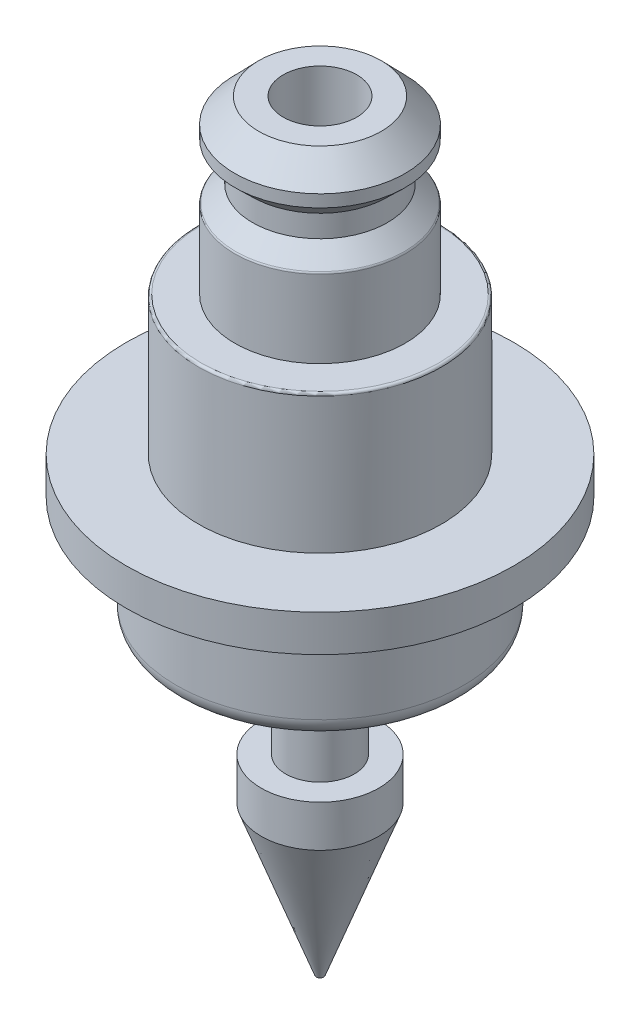
ISO-10303-21;
HEADER;
FILE_DESCRIPTION(('STEP AP214'),'2;1');
FILE_NAME('part.step','',(''),(''),'','','');
FILE_SCHEMA(('AUTOMOTIVE_DESIGN { 1 0 10303 214 1 1 1 1 }'));
ENDSEC;
DATA;
#1=APPLICATION_CONTEXT('core data for automotive mechanical design processes');
#2=APPLICATION_PROTOCOL_DEFINITION('international standard','automotive_design',2000,#1);
#3=PRODUCT_CONTEXT('',#1,'mechanical');
#4=PRODUCT('Part','Part','',(#3));
#5=PRODUCT_RELATED_PRODUCT_CATEGORY('part','',(#4));
#6=PRODUCT_DEFINITION_FORMATION('','',#4);
#7=PRODUCT_DEFINITION_CONTEXT('part definition',#1,'design');
#8=PRODUCT_DEFINITION('design','',#6,#7);
#9=PRODUCT_DEFINITION_SHAPE('','',#8);
#10=(LENGTH_UNIT() NAMED_UNIT(*) SI_UNIT(.MILLI.,.METRE.));
#11=(NAMED_UNIT(*) PLANE_ANGLE_UNIT() SI_UNIT($,.RADIAN.));
#12=(NAMED_UNIT(*) SI_UNIT($,.STERADIAN.) SOLID_ANGLE_UNIT());
#13=UNCERTAINTY_MEASURE_WITH_UNIT(LENGTH_MEASURE(1.E-05),#10,'distance_accuracy_value','');
#14=(GEOMETRIC_REPRESENTATION_CONTEXT(3) GLOBAL_UNCERTAINTY_ASSIGNED_CONTEXT((#13)) GLOBAL_UNIT_ASSIGNED_CONTEXT((#10,
#11,#12)) REPRESENTATION_CONTEXT('',''));
#15=CARTESIAN_POINT('',(0.,0.,0.));
#16=DIRECTION('',(0.,0.,1.));
#17=DIRECTION('',(1.,0.,0.));
#18=AXIS2_PLACEMENT_3D('',#15,#16,#17);
#19=CARTESIAN_POINT('',(0.,0.,0.));
#20=DIRECTION('',(0.,-1.,0.));
#21=DIRECTION('',(0.,0.,-1.));
#22=AXIS2_PLACEMENT_3D('',#19,#20,#21);
#23=CYLINDRICAL_SURFACE('',#22,1.5);
#24=CARTESIAN_POINT('',(0.,0.,0.));
#25=DIRECTION('',(0.,-1.,0.));
#26=DIRECTION('',(0.,0.,-1.));
#27=AXIS2_PLACEMENT_3D('',#24,#25,#26);
#28=CIRCLE('',#27,1.5);
#29=CARTESIAN_POINT('',(0.,0.,-1.5));
#30=VERTEX_POINT('',#29);
#31=EDGE_CURVE('E109',#30,#30,#28,.T.);
#32=ORIENTED_EDGE('',*,*,#31,.T.);
#33=EDGE_LOOP('',(#32));
#34=FACE_BOUND('',#33,.T.);
#35=CARTESIAN_POINT('',(0.,14.15,0.));
#36=DIRECTION('',(0.,-1.,0.));
#37=DIRECTION('',(0.,0.,-1.));
#38=AXIS2_PLACEMENT_3D('',#35,#36,#37);
#39=CIRCLE('',#38,1.5);
#40=CARTESIAN_POINT('',(0.,14.15,-1.5));
#41=VERTEX_POINT('',#40);
#42=EDGE_CURVE('E58',#41,#41,#39,.T.);
#43=ORIENTED_EDGE('',*,*,#42,.F.);
#44=EDGE_LOOP('',(#43));
#45=FACE_BOUND('',#44,.T.);
#46=ADVANCED_FACE('F32',(#34,#45),#23,.F.);
#47=CARTESIAN_POINT('',(1.5,14.15,0.));
#48=DIRECTION('',(0.,1.,0.));
#49=DIRECTION('',(0.,0.,1.));
#50=AXIS2_PLACEMENT_3D('',#47,#48,#49);
#51=PLANE('',#50);
#52=ORIENTED_EDGE('',*,*,#42,.T.);
#53=EDGE_LOOP('',(#52));
#54=FACE_BOUND('',#53,.T.);
#55=CARTESIAN_POINT('',(0.,14.15,0.));
#56=DIRECTION('',(0.,-1.,0.));
#57=DIRECTION('',(0.,0.,-1.));
#58=AXIS2_PLACEMENT_3D('',#55,#56,#57);
#59=CIRCLE('',#58,2.5);
#60=CARTESIAN_POINT('',(0.,14.15,-2.5));
#61=VERTEX_POINT('',#60);
#62=EDGE_CURVE('E61',#61,#61,#59,.T.);
#63=ORIENTED_EDGE('',*,*,#62,.F.);
#64=EDGE_LOOP('',(#63));
#65=FACE_BOUND('',#64,.T.);
#66=ADVANCED_FACE('F132',(#54,#65),#51,.T.);
#67=CARTESIAN_POINT('',(0.,13.15,0.));
#68=DIRECTION('',(0.,-1.,0.));
#69=DIRECTION('',(0.,0.,-1.));
#70=AXIS2_PLACEMENT_3D('',#67,#68,#69);
#71=CONICAL_SURFACE('',#70,3.475,0.772740611563396);
#72=ORIENTED_EDGE('',*,*,#62,.T.);
#73=EDGE_LOOP('',(#72));
#74=FACE_BOUND('',#73,.T.);
#75=CARTESIAN_POINT('',(0.,13.15,0.));
#76=DIRECTION('',(0.,-1.,0.));
#77=DIRECTION('',(0.,0.,-1.));
#78=AXIS2_PLACEMENT_3D('',#75,#76,#77);
#79=CIRCLE('',#78,3.475);
#80=CARTESIAN_POINT('',(0.,13.15,-3.475));
#81=VERTEX_POINT('',#80);
#82=EDGE_CURVE('E64',#81,#81,#79,.T.);
#83=ORIENTED_EDGE('',*,*,#82,.F.);
#84=EDGE_LOOP('',(#83));
#85=FACE_BOUND('',#84,.T.);
#86=ADVANCED_FACE('F137',(#74,#85),#71,.T.);
#87=CARTESIAN_POINT('',(0.,0.,0.));
#88=DIRECTION('',(0.,-1.,0.));
#89=DIRECTION('',(0.,0.,-1.));
#90=AXIS2_PLACEMENT_3D('',#87,#88,#89);
#91=CYLINDRICAL_SURFACE('',#90,3.475);
#92=ORIENTED_EDGE('',*,*,#82,.T.);
#93=EDGE_LOOP('',(#92));
#94=FACE_BOUND('',#93,.T.);
#95=CARTESIAN_POINT('',(0.,12.65,0.));
#96=DIRECTION('',(0.,-1.,0.));
#97=DIRECTION('',(0.,0.,-1.));
#98=AXIS2_PLACEMENT_3D('',#95,#96,#97);
#99=CIRCLE('',#98,3.475);
#100=CARTESIAN_POINT('',(0.,12.65,-3.475));
#101=VERTEX_POINT('',#100);
#102=EDGE_CURVE('E67',#101,#101,#99,.T.);
#103=ORIENTED_EDGE('',*,*,#102,.F.);
#104=EDGE_LOOP('',(#103));
#105=FACE_BOUND('',#104,.T.);
#106=ADVANCED_FACE('F179',(#94,#105),#91,.T.);
#107=CARTESIAN_POINT('',(0.,11.95,0.));
#108=DIRECTION('',(0.,1.,0.));
#109=DIRECTION('',(0.,0.,1.));
#110=AXIS2_PLACEMENT_3D('',#107,#108,#109);
#111=CONICAL_SURFACE('',#110,2.75,0.80294022345485);
#112=ORIENTED_EDGE('',*,*,#102,.T.);
#113=EDGE_LOOP('',(#112));
#114=FACE_BOUND('',#113,.T.);
#115=CARTESIAN_POINT('',(0.,11.95,0.));
#116=DIRECTION('',(0.,-1.,0.));
#117=DIRECTION('',(0.,0.,-1.));
#118=AXIS2_PLACEMENT_3D('',#115,#116,#117);
#119=CIRCLE('',#118,2.75);
#120=CARTESIAN_POINT('',(0.,11.95,-2.75));
#121=VERTEX_POINT('',#120);
#122=EDGE_CURVE('E70',#121,#121,#119,.T.);
#123=ORIENTED_EDGE('',*,*,#122,.F.);
#124=EDGE_LOOP('',(#123));
#125=FACE_BOUND('',#124,.T.);
#126=ADVANCED_FACE('F175',(#114,#125),#111,.T.);
#127=CARTESIAN_POINT('',(0.,0.,0.));
#128=DIRECTION('',(0.,-1.,0.));
#129=DIRECTION('',(0.,0.,-1.));
#130=AXIS2_PLACEMENT_3D('',#127,#128,#129);
#131=CYLINDRICAL_SURFACE('',#130,2.75);
#132=ORIENTED_EDGE('',*,*,#122,.T.);
#133=EDGE_LOOP('',(#132));
#134=FACE_BOUND('',#133,.T.);
#135=CARTESIAN_POINT('',(0.,11.05,0.));
#136=DIRECTION('',(0.,-1.,0.));
#137=DIRECTION('',(0.,0.,-1.));
#138=AXIS2_PLACEMENT_3D('',#135,#136,#137);
#139=CIRCLE('',#138,2.75);
#140=CARTESIAN_POINT('',(0.,11.05,-2.75));
#141=VERTEX_POINT('',#140);
#142=EDGE_CURVE('E73',#141,#141,#139,.T.);
#143=ORIENTED_EDGE('',*,*,#142,.F.);
#144=EDGE_LOOP('',(#143));
#145=FACE_BOUND('',#144,.T.);
#146=ADVANCED_FACE('F171',(#134,#145),#131,.T.);
#147=CARTESIAN_POINT('',(0.,10.35,0.));
#148=DIRECTION('',(0.,-1.,0.));
#149=DIRECTION('',(0.,0.,-1.));
#150=AXIS2_PLACEMENT_3D('',#147,#148,#149);
#151=CONICAL_SURFACE('',#150,3.475,0.802940223454851);
#152=CARTESIAN_POINT('',(0.,10.3794874262635,0.));
#153=DIRECTION('',(0.,1.,0.));
#154=DIRECTION('',(0.,0.,1.));
#155=AXIS2_PLACEMENT_3D('',#152,#153,#154);
#156=CIRCLE('',#155,3.44445945136996);
#157=CARTESIAN_POINT('',(0.,10.3794874262635,3.44445945136996));
#158=VERTEX_POINT('',#157);
#159=EDGE_CURVE('E43',#158,#158,#156,.T.);
#160=ORIENTED_EDGE('',*,*,#159,.T.);
#161=EDGE_LOOP('',(#160));
#162=FACE_BOUND('',#161,.T.);
#163=ORIENTED_EDGE('',*,*,#142,.T.);
#164=EDGE_LOOP('',(#163));
#165=FACE_BOUND('',#164,.T.);
#166=ADVANCED_FACE('F155',(#162,#165),#151,.T.);
#167=CARTESIAN_POINT('',(0.,0.,0.));
#168=DIRECTION('',(0.,-1.,0.));
#169=DIRECTION('',(0.,0.,-1.));
#170=AXIS2_PLACEMENT_3D('',#167,#168,#169);
#171=CYLINDRICAL_SURFACE('',#170,3.475);
#172=CARTESIAN_POINT('',(0.,10.3075472802017,0.));
#173=DIRECTION('',(0.,1.,0.));
#174=DIRECTION('',(0.,0.,1.));
#175=AXIS2_PLACEMENT_3D('',#172,#173,#174);
#176=CIRCLE('',#175,3.475);
#177=CARTESIAN_POINT('',(0.,10.3075472802017,3.475));
#178=VERTEX_POINT('',#177);
#179=EDGE_CURVE('E47',#178,#178,#176,.F.);
#180=ORIENTED_EDGE('',*,*,#179,.T.);
#181=EDGE_LOOP('',(#180));
#182=FACE_BOUND('',#181,.T.);
#183=CARTESIAN_POINT('',(0.,7.15,0.));
#184=DIRECTION('',(0.,-1.,0.));
#185=DIRECTION('',(0.,0.,-1.));
#186=AXIS2_PLACEMENT_3D('',#183,#184,#185);
#187=CIRCLE('',#186,3.475);
#188=CARTESIAN_POINT('',(0.,7.15,-3.475));
#189=VERTEX_POINT('',#188);
#190=EDGE_CURVE('E76',#189,#189,#187,.T.);
#191=ORIENTED_EDGE('',*,*,#190,.F.);
#192=EDGE_LOOP('',(#191));
#193=FACE_BOUND('',#192,.T.);
#194=ADVANCED_FACE('F151',(#182,#193),#171,.T.);
#195=CARTESIAN_POINT('',(3.475,7.15,0.));
#196=DIRECTION('',(0.,1.,0.));
#197=DIRECTION('',(0.,0.,1.));
#198=AXIS2_PLACEMENT_3D('',#195,#196,#197);
#199=PLANE('',#198);
#200=CARTESIAN_POINT('',(0.,7.15,0.));
#201=DIRECTION('',(0.,1.,0.));
#202=DIRECTION('',(0.,0.,1.));
#203=AXIS2_PLACEMENT_3D('',#200,#201,#202);
#204=CIRCLE('',#203,4.855);
#205=CARTESIAN_POINT('',(0.,7.15,4.855));
#206=VERTEX_POINT('',#205);
#207=EDGE_CURVE('E10',#206,#206,#204,.T.);
#208=ORIENTED_EDGE('',*,*,#207,.T.);
#209=EDGE_LOOP('',(#208));
#210=FACE_BOUND('',#209,.T.);
#211=ORIENTED_EDGE('',*,*,#190,.T.);
#212=EDGE_LOOP('',(#211));
#213=FACE_BOUND('',#212,.T.);
#214=ADVANCED_FACE('F154',(#210,#213),#199,.T.);
#215=CARTESIAN_POINT('',(0.,0.,0.));
#216=DIRECTION('',(0.,-1.,0.));
#217=DIRECTION('',(0.,0.,-1.));
#218=AXIS2_PLACEMENT_3D('',#215,#216,#217);
#219=CYLINDRICAL_SURFACE('',#218,4.955);
#220=CARTESIAN_POINT('',(0.,7.05,0.));
#221=DIRECTION('',(0.,1.,0.));
#222=DIRECTION('',(0.,0.,1.));
#223=AXIS2_PLACEMENT_3D('',#220,#221,#222);
#224=CIRCLE('',#223,4.955);
#225=CARTESIAN_POINT('',(0.,7.05,4.955));
#226=VERTEX_POINT('',#225);
#227=EDGE_CURVE('E39',#226,#226,#224,.F.);
#228=ORIENTED_EDGE('',*,*,#227,.T.);
#229=EDGE_LOOP('',(#228));
#230=FACE_BOUND('',#229,.T.);
#231=CARTESIAN_POINT('',(0.,1.5,0.));
#232=DIRECTION('',(0.,-1.,0.));
#233=DIRECTION('',(0.,0.,-1.));
#234=AXIS2_PLACEMENT_3D('',#231,#232,#233);
#235=CIRCLE('',#234,4.955);
#236=CARTESIAN_POINT('',(0.,1.5,-4.955));
#237=VERTEX_POINT('',#236);
#238=EDGE_CURVE('E79',#237,#237,#235,.T.);
#239=ORIENTED_EDGE('',*,*,#238,.F.);
#240=EDGE_LOOP('',(#239));
#241=FACE_BOUND('',#240,.T.);
#242=ADVANCED_FACE('F160',(#230,#241),#219,.T.);
#243=CARTESIAN_POINT('',(4.955,1.5,0.));
#244=DIRECTION('',(0.,1.,0.));
#245=DIRECTION('',(0.,0.,1.));
#246=AXIS2_PLACEMENT_3D('',#243,#244,#245);
#247=PLANE('',#246);
#248=ORIENTED_EDGE('',*,*,#238,.T.);
#249=EDGE_LOOP('',(#248));
#250=FACE_BOUND('',#249,.T.);
#251=CARTESIAN_POINT('',(0.,1.5,0.));
#252=DIRECTION('',(0.,-1.,0.));
#253=DIRECTION('',(0.,0.,-1.));
#254=AXIS2_PLACEMENT_3D('',#251,#252,#253);
#255=CIRCLE('',#254,7.9);
#256=CARTESIAN_POINT('',(0.,1.5,-7.9));
#257=VERTEX_POINT('',#256);
#258=EDGE_CURVE('E82',#257,#257,#255,.T.);
#259=ORIENTED_EDGE('',*,*,#258,.F.);
#260=EDGE_LOOP('',(#259));
#261=FACE_BOUND('',#260,.T.);
#262=ADVANCED_FACE('F165',(#250,#261),#247,.T.);
#263=CARTESIAN_POINT('',(0.,0.,0.));
#264=DIRECTION('',(0.,-1.,0.));
#265=DIRECTION('',(0.,0.,-1.));
#266=AXIS2_PLACEMENT_3D('',#263,#264,#265);
#267=CYLINDRICAL_SURFACE('',#266,7.9);
#268=ORIENTED_EDGE('',*,*,#258,.T.);
#269=EDGE_LOOP('',(#268));
#270=FACE_BOUND('',#269,.T.);
#271=CARTESIAN_POINT('',(0.,0.,0.));
#272=DIRECTION('',(0.,-1.,0.));
#273=DIRECTION('',(0.,0.,-1.));
#274=AXIS2_PLACEMENT_3D('',#271,#272,#273);
#275=CIRCLE('',#274,7.9);
#276=CARTESIAN_POINT('',(0.,0.,-7.9));
#277=VERTEX_POINT('',#276);
#278=EDGE_CURVE('E85',#277,#277,#275,.T.);
#279=ORIENTED_EDGE('',*,*,#278,.F.);
#280=EDGE_LOOP('',(#279));
#281=FACE_BOUND('',#280,.T.);
#282=ADVANCED_FACE('F327',(#270,#281),#267,.T.);
#283=CARTESIAN_POINT('',(7.9,0.,0.));
#284=DIRECTION('',(0.,-1.,0.));
#285=DIRECTION('',(0.,0.,-1.));
#286=AXIS2_PLACEMENT_3D('',#283,#284,#285);
#287=PLANE('',#286);
#288=ORIENTED_EDGE('',*,*,#278,.T.);
#289=EDGE_LOOP('',(#288));
#290=FACE_BOUND('',#289,.T.);
#291=CARTESIAN_POINT('',(0.,0.,0.));
#292=DIRECTION('',(0.,-1.,0.));
#293=DIRECTION('',(0.,0.,-1.));
#294=AXIS2_PLACEMENT_3D('',#291,#292,#293);
#295=CIRCLE('',#294,5.85);
#296=CARTESIAN_POINT('',(0.,0.,-5.85));
#297=VERTEX_POINT('',#296);
#298=EDGE_CURVE('E88',#297,#297,#295,.T.);
#299=ORIENTED_EDGE('',*,*,#298,.F.);
#300=EDGE_LOOP('',(#299));
#301=FACE_BOUND('',#300,.T.);
#302=ADVANCED_FACE('F318',(#290,#301),#287,.T.);
#303=CARTESIAN_POINT('',(0.,0.,0.));
#304=DIRECTION('',(0.,-1.,0.));
#305=DIRECTION('',(0.,0.,-1.));
#306=AXIS2_PLACEMENT_3D('',#303,#304,#305);
#307=CYLINDRICAL_SURFACE('',#306,5.85);
#308=CARTESIAN_POINT('',(0.,-3.75,0.));
#309=DIRECTION('',(0.,-1.,0.));
#310=DIRECTION('',(0.,0.,-1.));
#311=AXIS2_PLACEMENT_3D('',#308,#309,#310);
#312=CIRCLE('',#311,5.85);
#313=CARTESIAN_POINT('',(0.,-3.75,-5.85));
#314=VERTEX_POINT('',#313);
#315=EDGE_CURVE('E52',#314,#314,#312,.F.);
#316=ORIENTED_EDGE('',*,*,#315,.T.);
#317=EDGE_LOOP('',(#316));
#318=FACE_BOUND('',#317,.T.);
#319=ORIENTED_EDGE('',*,*,#298,.T.);
#320=EDGE_LOOP('',(#319));
#321=FACE_BOUND('',#320,.T.);
#322=ADVANCED_FACE('F309',(#318,#321),#307,.T.);
#323=CARTESIAN_POINT('',(5.85,-4.5,0.));
#324=DIRECTION('',(0.,-1.,0.));
#325=DIRECTION('',(0.,0.,-1.));
#326=AXIS2_PLACEMENT_3D('',#323,#324,#325);
#327=PLANE('',#326);
#328=CARTESIAN_POINT('',(0.,-4.5,0.));
#329=DIRECTION('',(0.,-1.,0.));
#330=DIRECTION('',(0.,0.,-1.));
#331=AXIS2_PLACEMENT_3D('',#328,#329,#330);
#332=CIRCLE('',#331,5.1);
#333=CARTESIAN_POINT('',(0.,-4.5,-5.1));
#334=VERTEX_POINT('',#333);
#335=EDGE_CURVE('E55',#334,#334,#332,.T.);
#336=ORIENTED_EDGE('',*,*,#335,.T.);
#337=EDGE_LOOP('',(#336));
#338=FACE_BOUND('',#337,.T.);
#339=CARTESIAN_POINT('',(0.,-4.5,0.));
#340=DIRECTION('',(0.,-1.,0.));
#341=DIRECTION('',(0.,0.,-1.));
#342=AXIS2_PLACEMENT_3D('',#339,#340,#341);
#343=CIRCLE('',#342,1.4);
#344=CARTESIAN_POINT('',(0.,-4.5,-1.4));
#345=VERTEX_POINT('',#344);
#346=EDGE_CURVE('E91',#345,#345,#343,.T.);
#347=ORIENTED_EDGE('',*,*,#346,.F.);
#348=EDGE_LOOP('',(#347));
#349=FACE_BOUND('',#348,.T.);
#350=ADVANCED_FACE('F300',(#338,#349),#327,.T.);
#351=CARTESIAN_POINT('',(0.,0.,0.));
#352=DIRECTION('',(0.,-1.,0.));
#353=DIRECTION('',(0.,0.,-1.));
#354=AXIS2_PLACEMENT_3D('',#351,#352,#353);
#355=CYLINDRICAL_SURFACE('',#354,1.4);
#356=ORIENTED_EDGE('',*,*,#346,.T.);
#357=EDGE_LOOP('',(#356));
#358=FACE_BOUND('',#357,.T.);
#359=CARTESIAN_POINT('',(0.,-9.1,0.));
#360=DIRECTION('',(0.,-1.,0.));
#361=DIRECTION('',(0.,0.,-1.));
#362=AXIS2_PLACEMENT_3D('',#359,#360,#361);
#363=CIRCLE('',#362,1.4);
#364=CARTESIAN_POINT('',(0.,-9.1,-1.4));
#365=VERTEX_POINT('',#364);
#366=EDGE_CURVE('E94',#365,#365,#363,.T.);
#367=ORIENTED_EDGE('',*,*,#366,.F.);
#368=EDGE_LOOP('',(#367));
#369=FACE_BOUND('',#368,.T.);
#370=ADVANCED_FACE('F290',(#358,#369),#355,.T.);
#371=CARTESIAN_POINT('',(1.4,-9.1,0.));
#372=DIRECTION('',(0.,1.,0.));
#373=DIRECTION('',(0.,0.,1.));
#374=AXIS2_PLACEMENT_3D('',#371,#372,#373);
#375=PLANE('',#374);
#376=ORIENTED_EDGE('',*,*,#366,.T.);
#377=EDGE_LOOP('',(#376));
#378=FACE_BOUND('',#377,.T.);
#379=CARTESIAN_POINT('',(0.,-9.1,0.));
#380=DIRECTION('',(0.,-1.,0.));
#381=DIRECTION('',(0.,0.,-1.));
#382=AXIS2_PLACEMENT_3D('',#379,#380,#381);
#383=CIRCLE('',#382,2.4);
#384=CARTESIAN_POINT('',(0.,-9.1,-2.4));
#385=VERTEX_POINT('',#384);
#386=EDGE_CURVE('E97',#385,#385,#383,.T.);
#387=ORIENTED_EDGE('',*,*,#386,.F.);
#388=EDGE_LOOP('',(#387));
#389=FACE_BOUND('',#388,.T.);
#390=ADVANCED_FACE('F280',(#378,#389),#375,.T.);
#391=CARTESIAN_POINT('',(0.,0.,0.));
#392=DIRECTION('',(0.,-1.,0.));
#393=DIRECTION('',(0.,0.,-1.));
#394=AXIS2_PLACEMENT_3D('',#391,#392,#393);
#395=CYLINDRICAL_SURFACE('',#394,2.4);
#396=ORIENTED_EDGE('',*,*,#386,.T.);
#397=EDGE_LOOP('',(#396));
#398=FACE_BOUND('',#397,.T.);
#399=CARTESIAN_POINT('',(0.,-10.8,0.));
#400=DIRECTION('',(0.,-1.,0.));
#401=DIRECTION('',(0.,0.,-1.));
#402=AXIS2_PLACEMENT_3D('',#399,#400,#401);
#403=CIRCLE('',#402,2.4);
#404=CARTESIAN_POINT('',(0.,-10.8,2.4));
#405=VERTEX_POINT('',#404);
#406=EDGE_CURVE('E100',#405,#405,#403,.T.);
#407=ORIENTED_EDGE('',*,*,#406,.F.);
#408=EDGE_LOOP('',(#407));
#409=FACE_BOUND('',#408,.T.);
#410=ADVANCED_FACE('F270',(#398,#409),#395,.T.);
#411=CARTESIAN_POINT('',(0.,-16.9,0.));
#412=DIRECTION('',(0.,1.,0.));
#413=DIRECTION('',(0.,0.,1.));
#414=AXIS2_PLACEMENT_3D('',#411,#412,#413);
#415=CONICAL_SURFACE('',#414,0.15,0.353370182719398);
#416=CARTESIAN_POINT('',(0.,-16.9,0.));
#417=DIRECTION('',(0.,-1.,0.));
#418=DIRECTION('',(0.,0.,-1.));
#419=AXIS2_PLACEMENT_3D('',#416,#417,#418);
#420=CIRCLE('',#419,0.15);
#421=CARTESIAN_POINT('',(0.,-16.9,0.150000000000001));
#422=VERTEX_POINT('',#421);
#423=EDGE_CURVE('E103',#422,#422,#420,.T.);
#424=CARTESIAN_POINT('',(0.,-10.8,2.4));
#425=CARTESIAN_POINT('',(0.,-10.8635416666667,2.3765625));
#426=CARTESIAN_POINT('',(0.,-10.9270833333333,2.353125));
#427=CARTESIAN_POINT('',(0.,-11.0541666666667,2.30625));
#428=CARTESIAN_POINT('',(0.,-11.1177083333333,2.2828125));
#429=CARTESIAN_POINT('',(0.,-11.2447916666667,2.2359375));
#430=CARTESIAN_POINT('',(0.,-11.3083333333333,2.2125));
#431=CARTESIAN_POINT('',(0.,-11.4354166666667,2.165625));
#432=CARTESIAN_POINT('',(0.,-11.4989583333333,2.1421875));
#433=CARTESIAN_POINT('',(0.,-11.6260416666667,2.0953125));
#434=CARTESIAN_POINT('',(0.,-11.6895833333333,2.071875));
#435=CARTESIAN_POINT('',(0.,-11.8166666666667,2.025));
#436=CARTESIAN_POINT('',(0.,-11.8802083333333,2.0015625));
#437=CARTESIAN_POINT('',(0.,-12.0072916666667,1.9546875));
#438=CARTESIAN_POINT('',(0.,-12.0708333333333,1.93125));
#439=CARTESIAN_POINT('',(0.,-12.1979166666667,1.884375));
#440=CARTESIAN_POINT('',(0.,-12.2614583333333,1.8609375));
#441=CARTESIAN_POINT('',(0.,-12.3885416666667,1.8140625));
#442=CARTESIAN_POINT('',(0.,-12.4520833333333,1.790625));
#443=CARTESIAN_POINT('',(0.,-12.5791666666667,1.74375));
#444=CARTESIAN_POINT('',(0.,-12.6427083333333,1.7203125));
#445=CARTESIAN_POINT('',(0.,-12.7697916666667,1.6734375));
#446=CARTESIAN_POINT('',(0.,-12.8333333333333,1.65));
#447=CARTESIAN_POINT('',(0.,-12.9604166666667,1.603125));
#448=CARTESIAN_POINT('',(0.,-13.0239583333333,1.5796875));
#449=CARTESIAN_POINT('',(0.,-13.1510416666667,1.5328125));
#450=CARTESIAN_POINT('',(0.,-13.2145833333333,1.509375));
#451=CARTESIAN_POINT('',(0.,-13.3416666666667,1.4625));
#452=CARTESIAN_POINT('',(0.,-13.4052083333333,1.4390625));
#453=CARTESIAN_POINT('',(0.,-13.5322916666667,1.3921875));
#454=CARTESIAN_POINT('',(0.,-13.5958333333333,1.36875));
#455=CARTESIAN_POINT('',(0.,-13.7229166666667,1.321875));
#456=CARTESIAN_POINT('',(0.,-13.7864583333333,1.2984375));
#457=CARTESIAN_POINT('',(0.,-13.9135416666667,1.2515625));
#458=CARTESIAN_POINT('',(0.,-13.9770833333333,1.228125));
#459=CARTESIAN_POINT('',(0.,-14.1041666666667,1.18125));
#460=CARTESIAN_POINT('',(0.,-14.1677083333333,1.1578125));
#461=CARTESIAN_POINT('',(0.,-14.2947916666667,1.1109375));
#462=CARTESIAN_POINT('',(0.,-14.3583333333333,1.0875));
#463=CARTESIAN_POINT('',(0.,-14.4854166666667,1.040625));
#464=CARTESIAN_POINT('',(0.,-14.5489583333333,1.0171875));
#465=CARTESIAN_POINT('',(0.,-14.6760416666667,0.9703125));
#466=CARTESIAN_POINT('',(0.,-14.7395833333333,0.946875));
#467=CARTESIAN_POINT('',(0.,-14.8666666666667,0.9));
#468=CARTESIAN_POINT('',(0.,-14.9302083333333,0.8765625));
#469=CARTESIAN_POINT('',(0.,-15.0572916666667,0.8296875));
#470=CARTESIAN_POINT('',(0.,-15.1208333333333,0.80625));
#471=CARTESIAN_POINT('',(0.,-15.2479166666667,0.759375));
#472=CARTESIAN_POINT('',(0.,-15.3114583333333,0.7359375));
#473=CARTESIAN_POINT('',(0.,-15.4385416666667,0.6890625));
#474=CARTESIAN_POINT('',(0.,-15.5020833333333,0.665625));
#475=CARTESIAN_POINT('',(0.,-15.6291666666667,0.61875));
#476=CARTESIAN_POINT('',(0.,-15.6927083333333,0.595312500000001));
#477=CARTESIAN_POINT('',(0.,-15.8197916666667,0.548437500000001));
#478=CARTESIAN_POINT('',(0.,-15.8833333333333,0.525));
#479=CARTESIAN_POINT('',(0.,-16.0104166666667,0.478125));
#480=CARTESIAN_POINT('',(0.,-16.0739583333333,0.454687500000001));
#481=CARTESIAN_POINT('',(0.,-16.2010416666667,0.407812500000001));
#482=CARTESIAN_POINT('',(0.,-16.2645833333333,0.384375));
#483=CARTESIAN_POINT('',(0.,-16.3916666666667,0.3375));
#484=CARTESIAN_POINT('',(0.,-16.4552083333333,0.3140625));
#485=CARTESIAN_POINT('',(0.,-16.5822916666667,0.267187500000001));
#486=CARTESIAN_POINT('',(0.,-16.6458333333333,0.24375));
#487=CARTESIAN_POINT('',(0.,-16.7729166666667,0.196875000000001));
#488=CARTESIAN_POINT('',(0.,-16.8364583333333,0.173437500000001));
#489=CARTESIAN_POINT('',(0.,-16.9,0.150000000000001));
#490=B_SPLINE_CURVE_WITH_KNOTS('',3,(#424,#425,#426,#427,#428,#429,#430,#431,#432,#433,#434,
#435,#436,#437,#438,#439,#440,#441,#442,#443,#444,#445,#446,#447,#448,#449,#450,#451,#452,#453,
#454,#455,#456,#457,#458,#459,#460,#461,#462,#463,#464,#465,#466,#467,#468,#469,#470,#471,#472,
#473,#474,#475,#476,#477,#478,#479,#480,#481,#482,#483,#484,#485,#486,#487,#488,#489),
.UNSPECIFIED.,.F.,.F.,(4,2,2,2,2,2,2,2,2,2,2,2,2,2,2,2,2,2,2,2,2,2,2,2,2,2,2,2,2,2,2,2,4),(0.,
0.203179079339507,0.406358158679015,0.609537238018523,0.81271631735803,1.01589539669754,
1.21907447603705,1.42225355537655,1.62543263471606,1.82861171405557,2.03179079339508,
2.23496987273459,2.43814895207409,2.6413280314136,2.84450711075311,3.04768619009262,
3.25086526943212,3.45404434877163,3.65722342811114,3.86040250745065,4.06358158679015,
4.26676066612966,4.46993974546917,4.67311882480868,4.87629790414818,5.07947698348769,
5.2826560628272,5.48583514216671,5.68901422150622,5.89219330084573,6.09537238018523,
6.29855145952474,6.50173053886425),.UNSPECIFIED.);
#491=EDGE_CURVE('BSEAM128',#405,#422,#490,.T.);
#492=ORIENTED_EDGE('',*,*,#406,.T.);
#493=ORIENTED_EDGE('',*,*,#423,.F.);
#494=ORIENTED_EDGE('',*,*,#491,.T.);
#495=ORIENTED_EDGE('',*,*,#491,.F.);
#496=EDGE_LOOP('',(#492,#494,#493,#495));
#497=FACE_BOUND('',#496,.T.);
#498=ADVANCED_FACE('F128',(#497),#415,.T.);
#499=CARTESIAN_POINT('',(0.,0.,0.));
#500=DIRECTION('',(0.,-1.,0.));
#501=DIRECTION('',(0.,0.,-1.));
#502=AXIS2_PLACEMENT_3D('',#499,#500,#501);
#503=CYLINDRICAL_SURFACE('',#502,0.15);
#504=ORIENTED_EDGE('',*,*,#423,.T.);
#505=EDGE_LOOP('',(#504));
#506=FACE_BOUND('',#505,.T.);
#507=CARTESIAN_POINT('',(0.,0.,0.));
#508=DIRECTION('',(0.,-1.,0.));
#509=DIRECTION('',(0.,0.,-1.));
#510=AXIS2_PLACEMENT_3D('',#507,#508,#509);
#511=CIRCLE('',#510,0.15);
#512=CARTESIAN_POINT('',(0.,0.,-0.15));
#513=VERTEX_POINT('',#512);
#514=EDGE_CURVE('E106',#513,#513,#511,.T.);
#515=ORIENTED_EDGE('',*,*,#514,.F.);
#516=EDGE_LOOP('',(#515));
#517=FACE_BOUND('',#516,.T.);
#518=ADVANCED_FACE('F118',(#506,#517),#503,.F.);
#519=CARTESIAN_POINT('',(0.15,0.,0.));
#520=DIRECTION('',(0.,1.,0.));
#521=DIRECTION('',(0.,0.,1.));
#522=AXIS2_PLACEMENT_3D('',#519,#520,#521);
#523=PLANE('',#522);
#524=ORIENTED_EDGE('',*,*,#514,.T.);
#525=EDGE_LOOP('',(#524));
#526=FACE_BOUND('',#525,.T.);
#527=ORIENTED_EDGE('',*,*,#31,.F.);
#528=EDGE_LOOP('',(#527));
#529=FACE_BOUND('',#528,.T.);
#530=ADVANCED_FACE('F115',(#526,#529),#523,.T.);
#531=CARTESIAN_POINT('',(0.,-3.75,0.));
#532=DIRECTION('',(0.,-1.,0.));
#533=DIRECTION('',(0.,0.,-1.));
#534=AXIS2_PLACEMENT_3D('',#531,#532,#533);
#535=TOROIDAL_SURFACE('',#534,5.1,0.75);
#536=ORIENTED_EDGE('',*,*,#315,.F.);
#537=EDGE_LOOP('',(#536));
#538=FACE_BOUND('',#537,.T.);
#539=ORIENTED_EDGE('',*,*,#335,.F.);
#540=EDGE_LOOP('',(#539));
#541=FACE_BOUND('',#540,.T.);
#542=ADVANCED_FACE('F117',(#538,#541),#535,.T.);
#543=CARTESIAN_POINT('',(0.,10.3075472802017,0.));
#544=DIRECTION('',(0.,1.,0.));
#545=DIRECTION('',(0.,0.,1.));
#546=AXIS2_PLACEMENT_3D('',#543,#544,#545);
#547=TOROIDAL_SURFACE('',#546,3.375,0.1);
#548=ORIENTED_EDGE('',*,*,#159,.F.);
#549=EDGE_LOOP('',(#548));
#550=FACE_BOUND('',#549,.T.);
#551=ORIENTED_EDGE('',*,*,#179,.F.);
#552=EDGE_LOOP('',(#551));
#553=FACE_BOUND('',#552,.T.);
#554=ADVANCED_FACE('F125',(#550,#553),#547,.T.);
#555=CARTESIAN_POINT('',(0.,7.05,0.));
#556=DIRECTION('',(0.,1.,0.));
#557=DIRECTION('',(0.,0.,1.));
#558=AXIS2_PLACEMENT_3D('',#555,#556,#557);
#559=TOROIDAL_SURFACE('',#558,4.855,0.1);
#560=ORIENTED_EDGE('',*,*,#207,.F.);
#561=EDGE_LOOP('',(#560));
#562=FACE_BOUND('',#561,.T.);
#563=ORIENTED_EDGE('',*,*,#227,.F.);
#564=EDGE_LOOP('',(#563));
#565=FACE_BOUND('',#564,.T.);
#566=ADVANCED_FACE('F34',(#562,#565),#559,.T.);
#567=CLOSED_SHELL('',(#46,#66,#86,#106,#126,#146,#166,#194,#214,#242,#262,#282,#302,#322,#350,
#370,#390,#410,#498,#518,#530,#542,#554,#566));
#568=MANIFOLD_SOLID_BREP('B2',#567);
#569=ADVANCED_BREP_SHAPE_REPRESENTATION('',(#18,#568),#14);
#570=SHAPE_DEFINITION_REPRESENTATION(#9,#569);
ENDSEC;
END-ISO-10303-21;
